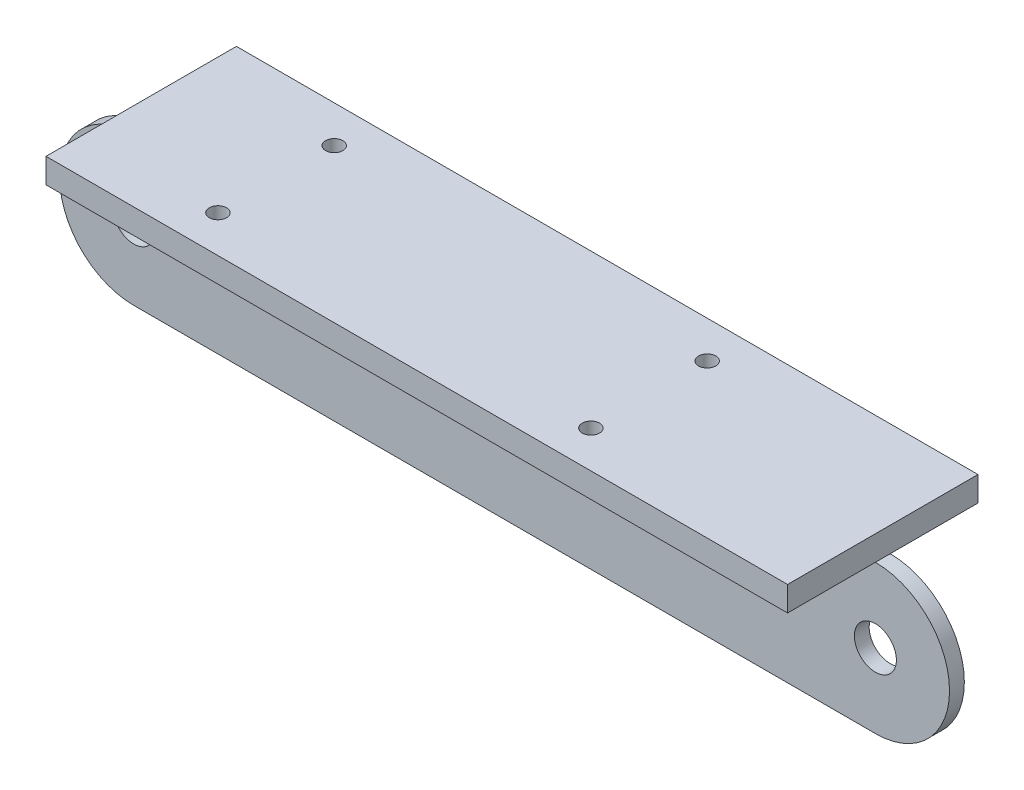
ISO-10303-21;
HEADER;
FILE_DESCRIPTION(('STEP AP214'),'2;1');
FILE_NAME('part.step','',(''),(''),'','','');
FILE_SCHEMA(('AUTOMOTIVE_DESIGN { 1 0 10303 214 1 1 1 1 }'));
ENDSEC;
DATA;
#1=APPLICATION_CONTEXT('core data for automotive mechanical design processes');
#2=APPLICATION_PROTOCOL_DEFINITION('international standard','automotive_design',2000,#1);
#3=PRODUCT_CONTEXT('',#1,'mechanical');
#4=PRODUCT('Part','Part','',(#3));
#5=PRODUCT_RELATED_PRODUCT_CATEGORY('part','',(#4));
#6=PRODUCT_DEFINITION_FORMATION('','',#4);
#7=PRODUCT_DEFINITION_CONTEXT('part definition',#1,'design');
#8=PRODUCT_DEFINITION('design','',#6,#7);
#9=PRODUCT_DEFINITION_SHAPE('','',#8);
#10=(LENGTH_UNIT() NAMED_UNIT(*) SI_UNIT(.MILLI.,.METRE.));
#11=(NAMED_UNIT(*) PLANE_ANGLE_UNIT() SI_UNIT($,.RADIAN.));
#12=(NAMED_UNIT(*) SI_UNIT($,.STERADIAN.) SOLID_ANGLE_UNIT());
#13=UNCERTAINTY_MEASURE_WITH_UNIT(LENGTH_MEASURE(1.E-05),#10,'distance_accuracy_value','');
#14=(GEOMETRIC_REPRESENTATION_CONTEXT(3) GLOBAL_UNCERTAINTY_ASSIGNED_CONTEXT((#13)) GLOBAL_UNIT_ASSIGNED_CONTEXT((#10,
#11,#12)) REPRESENTATION_CONTEXT('',''));
#15=CARTESIAN_POINT('',(0.,0.,0.));
#16=DIRECTION('',(0.,0.,1.));
#17=DIRECTION('',(1.,0.,0.));
#18=AXIS2_PLACEMENT_3D('',#15,#16,#17);
#19=CARTESIAN_POINT('',(-85.207100591716,11.1834319526627,3.));
#20=DIRECTION('',(0.,0.,-1.));
#21=DIRECTION('',(-1.,0.,0.));
#22=AXIS2_PLACEMENT_3D('',#19,#20,#21);
#23=PLANE('',#22);
#24=DIRECTION('',(-1.,0.,0.));
#25=VECTOR('',#24,1.);
#26=CARTESIAN_POINT('',(-85.207100591716,26.1834319526627,3.));
#27=LINE('',#26,#25);
#28=CARTESIAN_POINT('',(64.792899408284,26.1834319526627,3.));
#29=VERTEX_POINT('',#28);
#30=CARTESIAN_POINT('',(39.792899408284,26.1834319526627,3.));
#31=VERTEX_POINT('',#30);
#32=EDGE_CURVE('E279',#29,#31,#27,.T.);
#33=ORIENTED_EDGE('',*,*,#32,.T.);
#34=DIRECTION('',(0.,-1.,0.));
#35=VECTOR('',#34,1.);
#36=CARTESIAN_POINT('',(39.792899408284,26.1834319526627,3.));
#37=LINE('',#36,#35);
#38=CARTESIAN_POINT('',(39.792899408284,19.6834319526627,3.));
#39=VERTEX_POINT('',#38);
#40=EDGE_CURVE('E181',#31,#39,#37,.T.);
#41=ORIENTED_EDGE('',*,*,#40,.T.);
#42=DIRECTION('',(-1.,0.,0.));
#43=VECTOR('',#42,1.);
#44=CARTESIAN_POINT('',(39.792899408284,19.6834319526627,3.));
#45=LINE('',#44,#43);
#46=CARTESIAN_POINT('',(-60.207100591716,19.6834319526627,3.));
#47=VERTEX_POINT('',#46);
#48=EDGE_CURVE('E191',#39,#47,#45,.T.);
#49=ORIENTED_EDGE('',*,*,#48,.T.);
#50=DIRECTION('',(0.,-1.,0.));
#51=VECTOR('',#50,1.);
#52=CARTESIAN_POINT('',(-60.207100591716,26.1834319526627,3.));
#53=LINE('',#52,#51);
#54=CARTESIAN_POINT('',(-60.207100591716,26.1834319526627,3.));
#55=VERTEX_POINT('',#54);
#56=EDGE_CURVE('E166',#55,#47,#53,.T.);
#57=ORIENTED_EDGE('',*,*,#56,.F.);
#58=CARTESIAN_POINT('',(-85.207100591716,26.1834319526627,3.));
#59=VERTEX_POINT('',#58);
#60=EDGE_CURVE('E278',#55,#59,#27,.T.);
#61=ORIENTED_EDGE('',*,*,#60,.T.);
#62=CARTESIAN_POINT('',(-85.207100591716,11.1834319526627,3.));
#63=DIRECTION('',(0.,0.,1.));
#64=DIRECTION('',(-1.,0.,0.));
#65=AXIS2_PLACEMENT_3D('',#62,#63,#64);
#66=CIRCLE('',#65,15.);
#67=CARTESIAN_POINT('',(-85.207100591716,-3.81656804733729,3.));
#68=VERTEX_POINT('',#67);
#69=EDGE_CURVE('E267',#59,#68,#66,.T.);
#70=ORIENTED_EDGE('',*,*,#69,.T.);
#71=DIRECTION('',(1.,0.,0.));
#72=VECTOR('',#71,1.);
#73=CARTESIAN_POINT('',(-85.207100591716,-3.81656804733729,3.));
#74=LINE('',#73,#72);
#75=CARTESIAN_POINT('',(64.792899408284,-3.81656804733729,3.));
#76=VERTEX_POINT('',#75);
#77=EDGE_CURVE('E271',#68,#76,#74,.T.);
#78=ORIENTED_EDGE('',*,*,#77,.T.);
#79=CARTESIAN_POINT('',(64.792899408284,11.1834319526627,3.));
#80=DIRECTION('',(0.,0.,1.));
#81=DIRECTION('',(-1.,0.,0.));
#82=AXIS2_PLACEMENT_3D('',#79,#80,#81);
#83=CIRCLE('',#82,15.);
#84=EDGE_CURVE('E275',#76,#29,#83,.T.);
#85=ORIENTED_EDGE('',*,*,#84,.T.);
#86=EDGE_LOOP('',(#33,#41,#49,#57,#61,#70,#78,#85));
#87=FACE_BOUND('',#86,.T.);
#88=CARTESIAN_POINT('',(-85.207100591716,11.1834319526627,3.));
#89=DIRECTION('',(0.,0.,1.));
#90=DIRECTION('',(1.,0.,0.));
#91=AXIS2_PLACEMENT_3D('',#88,#89,#90);
#92=CIRCLE('',#91,4.25000000000001);
#93=CARTESIAN_POINT('',(-80.957100591716,11.1834319526627,3.));
#94=VERTEX_POINT('',#93);
#95=EDGE_CURVE('E259',#94,#94,#92,.T.);
#96=ORIENTED_EDGE('',*,*,#95,.F.);
#97=EDGE_LOOP('',(#96));
#98=FACE_BOUND('',#97,.T.);
#99=CARTESIAN_POINT('',(64.792899408284,11.1834319526627,3.));
#100=DIRECTION('',(0.,0.,1.));
#101=DIRECTION('',(1.,0.,0.));
#102=AXIS2_PLACEMENT_3D('',#99,#100,#101);
#103=CIRCLE('',#102,4.25000000000001);
#104=CARTESIAN_POINT('',(69.042899408284,11.1834319526627,3.));
#105=VERTEX_POINT('',#104);
#106=EDGE_CURVE('E251',#105,#105,#103,.T.);
#107=ORIENTED_EDGE('',*,*,#106,.F.);
#108=EDGE_LOOP('',(#107));
#109=FACE_BOUND('',#108,.T.);
#110=ADVANCED_FACE('F43',(#87,#98,#109),#23,.F.);
#111=CARTESIAN_POINT('',(-85.207100591716,11.1834319526627,0.));
#112=DIRECTION('',(0.,0.,-1.));
#113=DIRECTION('',(-1.,0.,0.));
#114=AXIS2_PLACEMENT_3D('',#111,#112,#113);
#115=PLANE('',#114);
#116=DIRECTION('',(0.,1.,0.));
#117=VECTOR('',#116,1.);
#118=CARTESIAN_POINT('',(39.792899408284,26.1834319526627,0.));
#119=LINE('',#118,#117);
#120=CARTESIAN_POINT('',(39.792899408284,19.6834319526627,0.));
#121=VERTEX_POINT('',#120);
#122=CARTESIAN_POINT('',(39.792899408284,26.1834319526627,0.));
#123=VERTEX_POINT('',#122);
#124=EDGE_CURVE('E156',#121,#123,#119,.T.);
#125=ORIENTED_EDGE('',*,*,#124,.T.);
#126=DIRECTION('',(-1.,0.,0.));
#127=VECTOR('',#126,1.);
#128=CARTESIAN_POINT('',(-85.207100591716,26.1834319526627,0.));
#129=LINE('',#128,#127);
#130=CARTESIAN_POINT('',(64.792899408284,26.1834319526627,0.));
#131=VERTEX_POINT('',#130);
#132=EDGE_CURVE('E272',#131,#123,#129,.T.);
#133=ORIENTED_EDGE('',*,*,#132,.F.);
#134=CARTESIAN_POINT('',(64.792899408284,11.1834319526627,0.));
#135=DIRECTION('',(0.,0.,1.));
#136=DIRECTION('',(-1.,0.,0.));
#137=AXIS2_PLACEMENT_3D('',#134,#135,#136);
#138=CIRCLE('',#137,15.);
#139=CARTESIAN_POINT('',(64.792899408284,-3.81656804733729,0.));
#140=VERTEX_POINT('',#139);
#141=EDGE_CURVE('E290',#140,#131,#138,.T.);
#142=ORIENTED_EDGE('',*,*,#141,.F.);
#143=DIRECTION('',(1.,0.,0.));
#144=VECTOR('',#143,1.);
#145=CARTESIAN_POINT('',(-85.207100591716,-3.81656804733729,0.));
#146=LINE('',#145,#144);
#147=CARTESIAN_POINT('',(-85.207100591716,-3.81656804733729,0.));
#148=VERTEX_POINT('',#147);
#149=EDGE_CURVE('E287',#148,#140,#146,.T.);
#150=ORIENTED_EDGE('',*,*,#149,.F.);
#151=CARTESIAN_POINT('',(-85.207100591716,11.1834319526627,0.));
#152=DIRECTION('',(0.,0.,1.));
#153=DIRECTION('',(-1.,0.,0.));
#154=AXIS2_PLACEMENT_3D('',#151,#152,#153);
#155=CIRCLE('',#154,15.);
#156=CARTESIAN_POINT('',(-85.207100591716,26.1834319526627,0.));
#157=VERTEX_POINT('',#156);
#158=EDGE_CURVE('E263',#157,#148,#155,.T.);
#159=ORIENTED_EDGE('',*,*,#158,.F.);
#160=CARTESIAN_POINT('',(-60.207100591716,26.1834319526627,0.));
#161=VERTEX_POINT('',#160);
#162=EDGE_CURVE('E294',#161,#157,#129,.T.);
#163=ORIENTED_EDGE('',*,*,#162,.F.);
#164=DIRECTION('',(0.,1.,0.));
#165=VECTOR('',#164,1.);
#166=CARTESIAN_POINT('',(-60.207100591716,26.1834319526627,0.));
#167=LINE('',#166,#165);
#168=CARTESIAN_POINT('',(-60.207100591716,19.6834319526627,0.));
#169=VERTEX_POINT('',#168);
#170=EDGE_CURVE('E66',#169,#161,#167,.T.);
#171=ORIENTED_EDGE('',*,*,#170,.F.);
#172=DIRECTION('',(-1.,0.,0.));
#173=VECTOR('',#172,1.);
#174=CARTESIAN_POINT('',(39.792899408284,19.6834319526627,0.));
#175=LINE('',#174,#173);
#176=EDGE_CURVE('E61',#121,#169,#175,.T.);
#177=ORIENTED_EDGE('',*,*,#176,.F.);
#178=EDGE_LOOP('',(#125,#133,#142,#150,#159,#163,#171,#177));
#179=FACE_BOUND('',#178,.T.);
#180=CARTESIAN_POINT('',(-85.207100591716,11.1834319526627,0.));
#181=DIRECTION('',(0.,0.,1.));
#182=DIRECTION('',(1.,0.,0.));
#183=AXIS2_PLACEMENT_3D('',#180,#181,#182);
#184=CIRCLE('',#183,4.25000000000001);
#185=CARTESIAN_POINT('',(-80.957100591716,11.1834319526627,0.));
#186=VERTEX_POINT('',#185);
#187=EDGE_CURVE('E255',#186,#186,#184,.T.);
#188=ORIENTED_EDGE('',*,*,#187,.T.);
#189=EDGE_LOOP('',(#188));
#190=FACE_BOUND('',#189,.T.);
#191=CARTESIAN_POINT('',(64.792899408284,11.1834319526627,0.));
#192=DIRECTION('',(0.,0.,1.));
#193=DIRECTION('',(1.,0.,0.));
#194=AXIS2_PLACEMENT_3D('',#191,#192,#193);
#195=CIRCLE('',#194,4.25000000000001);
#196=CARTESIAN_POINT('',(69.042899408284,11.1834319526627,0.));
#197=VERTEX_POINT('',#196);
#198=EDGE_CURVE('E250',#197,#197,#195,.T.);
#199=ORIENTED_EDGE('',*,*,#198,.T.);
#200=EDGE_LOOP('',(#199));
#201=FACE_BOUND('',#200,.T.);
#202=ADVANCED_FACE('F357',(#179,#190,#201),#115,.T.);
#203=CARTESIAN_POINT('',(-85.207100591716,11.1834319526627,3.));
#204=DIRECTION('',(0.,0.,-1.));
#205=DIRECTION('',(-1.,0.,0.));
#206=AXIS2_PLACEMENT_3D('',#203,#204,#205);
#207=CYLINDRICAL_SURFACE('',#206,15.);
#208=ORIENTED_EDGE('',*,*,#158,.T.);
#209=DIRECTION('',(0.,0.,-1.));
#210=VECTOR('',#209,1.);
#211=CARTESIAN_POINT('',(-85.207100591716,-3.81656804733729,3.));
#212=LINE('',#211,#210);
#213=EDGE_CURVE('E11',#68,#148,#212,.T.);
#214=ORIENTED_EDGE('',*,*,#213,.F.);
#215=ORIENTED_EDGE('',*,*,#69,.F.);
#216=DIRECTION('',(0.,0.,-1.));
#217=VECTOR('',#216,1.);
#218=CARTESIAN_POINT('',(-85.207100591716,26.1834319526627,3.));
#219=LINE('',#218,#217);
#220=EDGE_CURVE('E283',#59,#157,#219,.T.);
#221=ORIENTED_EDGE('',*,*,#220,.T.);
#222=EDGE_LOOP('',(#208,#214,#215,#221));
#223=FACE_BOUND('',#222,.T.);
#224=ADVANCED_FACE('F45',(#223),#207,.T.);
#225=CARTESIAN_POINT('',(-85.207100591716,-3.81656804733729,3.));
#226=DIRECTION('',(0.,1.,0.));
#227=DIRECTION('',(0.,0.,1.));
#228=AXIS2_PLACEMENT_3D('',#225,#226,#227);
#229=PLANE('',#228);
#230=ORIENTED_EDGE('',*,*,#149,.T.);
#231=DIRECTION('',(0.,0.,-1.));
#232=VECTOR('',#231,1.);
#233=CARTESIAN_POINT('',(64.792899408284,-3.81656804733729,3.));
#234=LINE('',#233,#232);
#235=EDGE_CURVE('E53',#76,#140,#234,.T.);
#236=ORIENTED_EDGE('',*,*,#235,.F.);
#237=ORIENTED_EDGE('',*,*,#77,.F.);
#238=ORIENTED_EDGE('',*,*,#213,.T.);
#239=EDGE_LOOP('',(#230,#236,#237,#238));
#240=FACE_BOUND('',#239,.T.);
#241=ADVANCED_FACE('F371',(#240),#229,.F.);
#242=CARTESIAN_POINT('',(64.792899408284,11.1834319526627,3.));
#243=DIRECTION('',(0.,0.,-1.));
#244=DIRECTION('',(-1.,0.,0.));
#245=AXIS2_PLACEMENT_3D('',#242,#243,#244);
#246=CYLINDRICAL_SURFACE('',#245,15.);
#247=ORIENTED_EDGE('',*,*,#141,.T.);
#248=DIRECTION('',(0.,0.,-1.));
#249=VECTOR('',#248,1.);
#250=CARTESIAN_POINT('',(64.792899408284,26.1834319526627,3.));
#251=LINE('',#250,#249);
#252=EDGE_CURVE('E300',#29,#131,#251,.T.);
#253=ORIENTED_EDGE('',*,*,#252,.F.);
#254=ORIENTED_EDGE('',*,*,#84,.F.);
#255=ORIENTED_EDGE('',*,*,#235,.T.);
#256=EDGE_LOOP('',(#247,#253,#254,#255));
#257=FACE_BOUND('',#256,.T.);
#258=ADVANCED_FACE('F369',(#257),#246,.T.);
#259=CARTESIAN_POINT('',(-85.207100591716,11.1834319526627,3.));
#260=DIRECTION('',(0.,0.,-1.));
#261=DIRECTION('',(-1.,0.,0.));
#262=AXIS2_PLACEMENT_3D('',#259,#260,#261);
#263=CYLINDRICAL_SURFACE('',#262,4.25000000000001);
#264=ORIENTED_EDGE('',*,*,#95,.T.);
#265=EDGE_LOOP('',(#264));
#266=FACE_BOUND('',#265,.T.);
#267=ORIENTED_EDGE('',*,*,#187,.F.);
#268=EDGE_LOOP('',(#267));
#269=FACE_BOUND('',#268,.T.);
#270=ADVANCED_FACE('F366',(#266,#269),#263,.F.);
#271=CARTESIAN_POINT('',(64.792899408284,11.1834319526627,3.));
#272=DIRECTION('',(0.,0.,-1.));
#273=DIRECTION('',(-1.,0.,0.));
#274=AXIS2_PLACEMENT_3D('',#271,#272,#273);
#275=CYLINDRICAL_SURFACE('',#274,4.25000000000001);
#276=ORIENTED_EDGE('',*,*,#106,.T.);
#277=EDGE_LOOP('',(#276));
#278=FACE_BOUND('',#277,.T.);
#279=ORIENTED_EDGE('',*,*,#198,.F.);
#280=EDGE_LOOP('',(#279));
#281=FACE_BOUND('',#280,.T.);
#282=ADVANCED_FACE('F435',(#278,#281),#275,.F.);
#283=CARTESIAN_POINT('',(0.,26.1834319526627,0.));
#284=DIRECTION('',(0.,1.,0.));
#285=DIRECTION('',(0.,0.,1.));
#286=AXIS2_PLACEMENT_3D('',#283,#284,#285);
#287=PLANE('',#286);
#288=CARTESIAN_POINT('',(-57.927100591716,26.1834319526627,13.26));
#289=DIRECTION('',(0.,1.,0.));
#290=DIRECTION('',(0.,0.,1.));
#291=AXIS2_PLACEMENT_3D('',#288,#289,#290);
#292=CIRCLE('',#291,1.75);
#293=CARTESIAN_POINT('',(-57.927100591716,26.1834319526627,15.01));
#294=VERTEX_POINT('',#293);
#295=EDGE_CURVE('E332',#294,#294,#292,.T.);
#296=ORIENTED_EDGE('',*,*,#295,.T.);
#297=EDGE_LOOP('',(#296));
#298=FACE_BOUND('',#297,.T.);
#299=CARTESIAN_POINT('',(17.512899408284,26.1834319526627,13.26));
#300=DIRECTION('',(0.,1.,0.));
#301=DIRECTION('',(0.,0.,1.));
#302=AXIS2_PLACEMENT_3D('',#299,#300,#301);
#303=CIRCLE('',#302,1.75);
#304=CARTESIAN_POINT('',(17.512899408284,26.1834319526627,15.01));
#305=VERTEX_POINT('',#304);
#306=EDGE_CURVE('E315',#305,#305,#303,.T.);
#307=ORIENTED_EDGE('',*,*,#306,.T.);
#308=EDGE_LOOP('',(#307));
#309=FACE_BOUND('',#308,.T.);
#310=DIRECTION('',(-1.,0.,0.));
#311=VECTOR('',#310,1.);
#312=CARTESIAN_POINT('',(39.792899408284,26.1834319526627,9.5));
#313=LINE('',#312,#311);
#314=CARTESIAN_POINT('',(39.792899408284,26.1834319526627,9.5));
#315=VERTEX_POINT('',#314);
#316=CARTESIAN_POINT('',(-60.207100591716,26.1834319526627,9.5));
#317=VERTEX_POINT('',#316);
#318=EDGE_CURVE('E199',#315,#317,#313,.T.);
#319=ORIENTED_EDGE('',*,*,#318,.F.);
#320=DIRECTION('',(0.,0.,-1.));
#321=VECTOR('',#320,1.);
#322=CARTESIAN_POINT('',(39.792899408284,26.1834319526627,9.5));
#323=LINE('',#322,#321);
#324=EDGE_CURVE('E189',#315,#31,#323,.T.);
#325=ORIENTED_EDGE('',*,*,#324,.T.);
#326=ORIENTED_EDGE('',*,*,#32,.F.);
#327=DIRECTION('',(0.,0.,-1.));
#328=VECTOR('',#327,1.);
#329=CARTESIAN_POINT('',(64.792899408284,26.1834319526627,-17.76));
#330=LINE('',#329,#328);
#331=CARTESIAN_POINT('',(64.792899408284,26.1834319526627,20.76));
#332=VERTEX_POINT('',#331);
#333=EDGE_CURVE('E229',#332,#29,#330,.T.);
#334=ORIENTED_EDGE('',*,*,#333,.F.);
#335=DIRECTION('',(1.,0.,0.));
#336=VECTOR('',#335,1.);
#337=CARTESIAN_POINT('',(-85.207100591716,26.1834319526627,20.76));
#338=LINE('',#337,#336);
#339=CARTESIAN_POINT('',(-85.207100591716,26.1834319526627,20.76));
#340=VERTEX_POINT('',#339);
#341=EDGE_CURVE('E225',#340,#332,#338,.T.);
#342=ORIENTED_EDGE('',*,*,#341,.F.);
#343=DIRECTION('',(0.,0.,1.));
#344=VECTOR('',#343,1.);
#345=CARTESIAN_POINT('',(-85.207100591716,26.1834319526627,-17.76));
#346=LINE('',#345,#344);
#347=EDGE_CURVE('E203',#59,#340,#346,.T.);
#348=ORIENTED_EDGE('',*,*,#347,.F.);
#349=ORIENTED_EDGE('',*,*,#60,.F.);
#350=DIRECTION('',(0.,0.,-1.));
#351=VECTOR('',#350,1.);
#352=CARTESIAN_POINT('',(-60.207100591716,26.1834319526627,9.5));
#353=LINE('',#352,#351);
#354=EDGE_CURVE('E185',#317,#55,#353,.T.);
#355=ORIENTED_EDGE('',*,*,#354,.F.);
#356=EDGE_LOOP('',(#319,#325,#326,#334,#342,#348,#349,#355));
#357=FACE_BOUND('',#356,.T.);
#358=ADVANCED_FACE('F340',(#298,#309,#357),#287,.F.);
#359=CARTESIAN_POINT('',(-85.207100591716,31.1834319526627,-17.76));
#360=DIRECTION('',(1.,0.,0.));
#361=DIRECTION('',(0.,0.,-1.));
#362=AXIS2_PLACEMENT_3D('',#359,#360,#361);
#363=PLANE('',#362);
#364=CARTESIAN_POINT('',(-85.207100591716,26.1834319526627,-17.76));
#365=VERTEX_POINT('',#364);
#366=EDGE_CURVE('E221',#365,#157,#346,.T.);
#367=ORIENTED_EDGE('',*,*,#366,.T.);
#368=ORIENTED_EDGE('',*,*,#220,.F.);
#369=ORIENTED_EDGE('',*,*,#347,.T.);
#370=DIRECTION('',(0.,-1.,0.));
#371=VECTOR('',#370,1.);
#372=CARTESIAN_POINT('',(-85.207100591716,31.1834319526627,20.76));
#373=LINE('',#372,#371);
#374=CARTESIAN_POINT('',(-85.207100591716,31.1834319526627,20.76));
#375=VERTEX_POINT('',#374);
#376=EDGE_CURVE('E246',#375,#340,#373,.T.);
#377=ORIENTED_EDGE('',*,*,#376,.F.);
#378=DIRECTION('',(0.,0.,1.));
#379=VECTOR('',#378,1.);
#380=CARTESIAN_POINT('',(-85.207100591716,31.1834319526627,-17.76));
#381=LINE('',#380,#379);
#382=CARTESIAN_POINT('',(-85.207100591716,31.1834319526627,-17.76));
#383=VERTEX_POINT('',#382);
#384=EDGE_CURVE('E206',#383,#375,#381,.T.);
#385=ORIENTED_EDGE('',*,*,#384,.F.);
#386=DIRECTION('',(0.,-1.,0.));
#387=VECTOR('',#386,1.);
#388=CARTESIAN_POINT('',(-85.207100591716,31.1834319526627,-17.76));
#389=LINE('',#388,#387);
#390=EDGE_CURVE('E220',#383,#365,#389,.T.);
#391=ORIENTED_EDGE('',*,*,#390,.T.);
#392=EDGE_LOOP('',(#367,#368,#369,#377,#385,#391));
#393=FACE_BOUND('',#392,.T.);
#394=ADVANCED_FACE('F431',(#393),#363,.F.);
#395=CARTESIAN_POINT('',(-85.207100591716,31.1834319526627,20.76));
#396=DIRECTION('',(0.,0.,-1.));
#397=DIRECTION('',(-1.,0.,0.));
#398=AXIS2_PLACEMENT_3D('',#395,#396,#397);
#399=PLANE('',#398);
#400=ORIENTED_EDGE('',*,*,#341,.T.);
#401=DIRECTION('',(0.,-1.,0.));
#402=VECTOR('',#401,1.);
#403=CARTESIAN_POINT('',(64.792899408284,31.1834319526627,20.76));
#404=LINE('',#403,#402);
#405=CARTESIAN_POINT('',(64.792899408284,31.1834319526627,20.76));
#406=VERTEX_POINT('',#405);
#407=EDGE_CURVE('E242',#406,#332,#404,.T.);
#408=ORIENTED_EDGE('',*,*,#407,.F.);
#409=DIRECTION('',(1.,0.,0.));
#410=VECTOR('',#409,1.);
#411=CARTESIAN_POINT('',(-85.207100591716,31.1834319526627,20.76));
#412=LINE('',#411,#410);
#413=EDGE_CURVE('E210',#375,#406,#412,.T.);
#414=ORIENTED_EDGE('',*,*,#413,.F.);
#415=ORIENTED_EDGE('',*,*,#376,.T.);
#416=EDGE_LOOP('',(#400,#408,#414,#415));
#417=FACE_BOUND('',#416,.T.);
#418=ADVANCED_FACE('F427',(#417),#399,.F.);
#419=CARTESIAN_POINT('',(64.792899408284,31.1834319526627,-17.76));
#420=DIRECTION('',(-1.,0.,0.));
#421=DIRECTION('',(0.,0.,1.));
#422=AXIS2_PLACEMENT_3D('',#419,#420,#421);
#423=PLANE('',#422);
#424=ORIENTED_EDGE('',*,*,#333,.T.);
#425=ORIENTED_EDGE('',*,*,#252,.T.);
#426=CARTESIAN_POINT('',(64.792899408284,26.1834319526627,-17.76));
#427=VERTEX_POINT('',#426);
#428=EDGE_CURVE('E228',#131,#427,#330,.T.);
#429=ORIENTED_EDGE('',*,*,#428,.T.);
#430=DIRECTION('',(0.,-1.,0.));
#431=VECTOR('',#430,1.);
#432=CARTESIAN_POINT('',(64.792899408284,31.1834319526627,-17.76));
#433=LINE('',#432,#431);
#434=CARTESIAN_POINT('',(64.792899408284,31.1834319526627,-17.76));
#435=VERTEX_POINT('',#434);
#436=EDGE_CURVE('E238',#435,#427,#433,.T.);
#437=ORIENTED_EDGE('',*,*,#436,.F.);
#438=DIRECTION('',(0.,0.,-1.));
#439=VECTOR('',#438,1.);
#440=CARTESIAN_POINT('',(64.792899408284,31.1834319526627,-17.76));
#441=LINE('',#440,#439);
#442=EDGE_CURVE('E214',#406,#435,#441,.T.);
#443=ORIENTED_EDGE('',*,*,#442,.F.);
#444=ORIENTED_EDGE('',*,*,#407,.T.);
#445=EDGE_LOOP('',(#424,#425,#429,#437,#443,#444));
#446=FACE_BOUND('',#445,.T.);
#447=ADVANCED_FACE('F423',(#446),#423,.F.);
#448=CARTESIAN_POINT('',(-85.207100591716,31.1834319526627,-17.76));
#449=DIRECTION('',(0.,0.,1.));
#450=DIRECTION('',(1.,0.,0.));
#451=AXIS2_PLACEMENT_3D('',#448,#449,#450);
#452=PLANE('',#451);
#453=DIRECTION('',(-1.,0.,0.));
#454=VECTOR('',#453,1.);
#455=CARTESIAN_POINT('',(-85.207100591716,26.1834319526627,-17.76));
#456=LINE('',#455,#454);
#457=EDGE_CURVE('E211',#427,#365,#456,.T.);
#458=ORIENTED_EDGE('',*,*,#457,.T.);
#459=ORIENTED_EDGE('',*,*,#390,.F.);
#460=DIRECTION('',(-1.,0.,0.));
#461=VECTOR('',#460,1.);
#462=CARTESIAN_POINT('',(-85.207100591716,31.1834319526627,-17.76));
#463=LINE('',#462,#461);
#464=EDGE_CURVE('E217',#435,#383,#463,.T.);
#465=ORIENTED_EDGE('',*,*,#464,.F.);
#466=ORIENTED_EDGE('',*,*,#436,.T.);
#467=EDGE_LOOP('',(#458,#459,#465,#466));
#468=FACE_BOUND('',#467,.T.);
#469=ADVANCED_FACE('F416',(#468),#452,.F.);
#470=CARTESIAN_POINT('',(0.,31.1834319526627,0.));
#471=DIRECTION('',(0.,1.,0.));
#472=DIRECTION('',(0.,0.,1.));
#473=AXIS2_PLACEMENT_3D('',#470,#471,#472);
#474=PLANE('',#473);
#475=CARTESIAN_POINT('',(-57.927100591716,31.1834319526627,-10.26));
#476=DIRECTION('',(0.,1.,0.));
#477=DIRECTION('',(0.,0.,-1.));
#478=AXIS2_PLACEMENT_3D('',#475,#476,#477);
#479=CIRCLE('',#478,1.75);
#480=CARTESIAN_POINT('',(-57.927100591716,31.1834319526627,-12.01));
#481=VERTEX_POINT('',#480);
#482=EDGE_CURVE('E327',#481,#481,#479,.T.);
#483=ORIENTED_EDGE('',*,*,#482,.F.);
#484=EDGE_LOOP('',(#483));
#485=FACE_BOUND('',#484,.T.);
#486=CARTESIAN_POINT('',(-57.927100591716,31.1834319526627,13.26));
#487=DIRECTION('',(0.,1.,0.));
#488=DIRECTION('',(0.,0.,1.));
#489=AXIS2_PLACEMENT_3D('',#486,#487,#488);
#490=CIRCLE('',#489,1.75);
#491=CARTESIAN_POINT('',(-57.927100591716,31.1834319526627,15.01));
#492=VERTEX_POINT('',#491);
#493=EDGE_CURVE('E323',#492,#492,#490,.T.);
#494=ORIENTED_EDGE('',*,*,#493,.F.);
#495=EDGE_LOOP('',(#494));
#496=FACE_BOUND('',#495,.T.);
#497=CARTESIAN_POINT('',(17.512899408284,31.1834319526627,13.26));
#498=DIRECTION('',(0.,1.,0.));
#499=DIRECTION('',(0.,0.,-1.));
#500=AXIS2_PLACEMENT_3D('',#497,#498,#499);
#501=CIRCLE('',#500,1.75);
#502=CARTESIAN_POINT('',(17.512899408284,31.1834319526627,11.51));
#503=VERTEX_POINT('',#502);
#504=EDGE_CURVE('E317',#503,#503,#501,.T.);
#505=ORIENTED_EDGE('',*,*,#504,.F.);
#506=EDGE_LOOP('',(#505));
#507=FACE_BOUND('',#506,.T.);
#508=CARTESIAN_POINT('',(17.512899408284,31.1834319526627,-10.26));
#509=DIRECTION('',(0.,1.,0.));
#510=DIRECTION('',(0.,0.,1.));
#511=AXIS2_PLACEMENT_3D('',#508,#509,#510);
#512=CIRCLE('',#511,1.75);
#513=CARTESIAN_POINT('',(17.512899408284,31.1834319526627,-8.50999999999999));
#514=VERTEX_POINT('',#513);
#515=EDGE_CURVE('E309',#514,#514,#512,.T.);
#516=ORIENTED_EDGE('',*,*,#515,.F.);
#517=EDGE_LOOP('',(#516));
#518=FACE_BOUND('',#517,.T.);
#519=ORIENTED_EDGE('',*,*,#384,.T.);
#520=ORIENTED_EDGE('',*,*,#413,.T.);
#521=ORIENTED_EDGE('',*,*,#442,.T.);
#522=ORIENTED_EDGE('',*,*,#464,.T.);
#523=EDGE_LOOP('',(#519,#520,#521,#522));
#524=FACE_BOUND('',#523,.T.);
#525=ADVANCED_FACE('F413',(#485,#496,#507,#518,#524),#474,.T.);
#526=CARTESIAN_POINT('',(-57.927100591716,26.1834319526627,-10.26));
#527=DIRECTION('',(0.,1.,0.));
#528=DIRECTION('',(0.,0.,1.));
#529=AXIS2_PLACEMENT_3D('',#526,#527,#528);
#530=CIRCLE('',#529,1.75);
#531=CARTESIAN_POINT('',(-57.927100591716,26.1834319526627,-8.50999999999999));
#532=VERTEX_POINT('',#531);
#533=EDGE_CURVE('E47',#532,#532,#530,.T.);
#534=ORIENTED_EDGE('',*,*,#533,.T.);
#535=EDGE_LOOP('',(#534));
#536=FACE_BOUND('',#535,.T.);
#537=CARTESIAN_POINT('',(17.512899408284,26.1834319526627,-10.26));
#538=DIRECTION('',(0.,1.,0.));
#539=DIRECTION('',(0.,0.,1.));
#540=AXIS2_PLACEMENT_3D('',#537,#538,#539);
#541=CIRCLE('',#540,1.75);
#542=CARTESIAN_POINT('',(17.512899408284,26.1834319526627,-8.50999999999999));
#543=VERTEX_POINT('',#542);
#544=EDGE_CURVE('E306',#543,#543,#541,.T.);
#545=ORIENTED_EDGE('',*,*,#544,.T.);
#546=EDGE_LOOP('',(#545));
#547=FACE_BOUND('',#546,.T.);
#548=ORIENTED_EDGE('',*,*,#132,.T.);
#549=DIRECTION('',(0.,0.,-1.));
#550=VECTOR('',#549,1.);
#551=CARTESIAN_POINT('',(39.792899408284,26.1834319526627,-6.50000000000031));
#552=LINE('',#551,#550);
#553=CARTESIAN_POINT('',(39.792899408284,26.1834319526627,-6.50000000000031));
#554=VERTEX_POINT('',#553);
#555=EDGE_CURVE('E152',#123,#554,#552,.T.);
#556=ORIENTED_EDGE('',*,*,#555,.T.);
#557=DIRECTION('',(-1.,0.,0.));
#558=VECTOR('',#557,1.);
#559=CARTESIAN_POINT('',(39.792899408284,26.1834319526627,-6.50000000000031));
#560=LINE('',#559,#558);
#561=CARTESIAN_POINT('',(-60.207100591716,26.1834319526627,-6.50000000000031));
#562=VERTEX_POINT('',#561);
#563=EDGE_CURVE('E145',#554,#562,#560,.T.);
#564=ORIENTED_EDGE('',*,*,#563,.T.);
#565=DIRECTION('',(0.,0.,-1.));
#566=VECTOR('',#565,1.);
#567=CARTESIAN_POINT('',(-60.207100591716,26.1834319526627,-6.50000000000031));
#568=LINE('',#567,#566);
#569=EDGE_CURVE('E150',#161,#562,#568,.T.);
#570=ORIENTED_EDGE('',*,*,#569,.F.);
#571=ORIENTED_EDGE('',*,*,#162,.T.);
#572=ORIENTED_EDGE('',*,*,#366,.F.);
#573=ORIENTED_EDGE('',*,*,#457,.F.);
#574=ORIENTED_EDGE('',*,*,#428,.F.);
#575=EDGE_LOOP('',(#548,#556,#564,#570,#571,#572,#573,#574));
#576=FACE_BOUND('',#575,.T.);
#577=ADVANCED_FACE('F148',(#536,#547,#576),#287,.F.);
#578=CARTESIAN_POINT('',(39.792899408284,19.6834319526627,3.));
#579=DIRECTION('',(0.,-0.707106781186548,0.707106781186547));
#580=DIRECTION('',(0.,-0.707106781186547,-0.707106781186548));
#581=AXIS2_PLACEMENT_3D('',#578,#579,#580);
#582=PLANE('',#581);
#583=DIRECTION('',(0.,0.707106781186547,0.707106781186548));
#584=VECTOR('',#583,1.);
#585=CARTESIAN_POINT('',(-60.207100591716,19.6834319526627,3.));
#586=LINE('',#585,#584);
#587=EDGE_CURVE('E170',#47,#317,#586,.T.);
#588=ORIENTED_EDGE('',*,*,#587,.F.);
#589=ORIENTED_EDGE('',*,*,#48,.F.);
#590=DIRECTION('',(0.,0.707106781186547,0.707106781186548));
#591=VECTOR('',#590,1.);
#592=CARTESIAN_POINT('',(39.792899408284,19.6834319526627,3.));
#593=LINE('',#592,#591);
#594=EDGE_CURVE('E184',#39,#315,#593,.T.);
#595=ORIENTED_EDGE('',*,*,#594,.T.);
#596=ORIENTED_EDGE('',*,*,#318,.T.);
#597=EDGE_LOOP('',(#588,#589,#595,#596));
#598=FACE_BOUND('',#597,.T.);
#599=ADVANCED_FACE('F405',(#598),#582,.T.);
#600=CARTESIAN_POINT('',(39.792899408284,0.,0.));
#601=DIRECTION('',(1.,0.,0.));
#602=DIRECTION('',(0.,0.,-1.));
#603=AXIS2_PLACEMENT_3D('',#600,#601,#602);
#604=PLANE('',#603);
#605=ORIENTED_EDGE('',*,*,#40,.F.);
#606=ORIENTED_EDGE('',*,*,#324,.F.);
#607=ORIENTED_EDGE('',*,*,#594,.F.);
#608=EDGE_LOOP('',(#605,#606,#607));
#609=FACE_BOUND('',#608,.T.);
#610=ADVANCED_FACE('F402',(#609),#604,.T.);
#611=CARTESIAN_POINT('',(-60.207100591716,0.,0.));
#612=DIRECTION('',(1.,0.,0.));
#613=DIRECTION('',(0.,0.,-1.));
#614=AXIS2_PLACEMENT_3D('',#611,#612,#613);
#615=PLANE('',#614);
#616=ORIENTED_EDGE('',*,*,#56,.T.);
#617=ORIENTED_EDGE('',*,*,#587,.T.);
#618=ORIENTED_EDGE('',*,*,#354,.T.);
#619=EDGE_LOOP('',(#616,#617,#618));
#620=FACE_BOUND('',#619,.T.);
#621=ADVANCED_FACE('F399',(#620),#615,.F.);
#622=CARTESIAN_POINT('',(39.792899408284,19.6834319526627,0.));
#623=DIRECTION('',(0.,-0.707106781186564,-0.707106781186531));
#624=DIRECTION('',(0.,0.707106781186531,-0.707106781186564));
#625=AXIS2_PLACEMENT_3D('',#622,#623,#624);
#626=PLANE('',#625);
#627=DIRECTION('',(0.,-0.707106781186531,0.707106781186564));
#628=VECTOR('',#627,1.);
#629=CARTESIAN_POINT('',(-60.207100591716,19.6834319526627,0.));
#630=LINE('',#629,#628);
#631=EDGE_CURVE('E159',#562,#169,#630,.T.);
#632=ORIENTED_EDGE('',*,*,#631,.F.);
#633=ORIENTED_EDGE('',*,*,#563,.F.);
#634=DIRECTION('',(0.,-0.707106781186531,0.707106781186564));
#635=VECTOR('',#634,1.);
#636=CARTESIAN_POINT('',(39.792899408284,19.6834319526627,0.));
#637=LINE('',#636,#635);
#638=EDGE_CURVE('E176',#554,#121,#637,.T.);
#639=ORIENTED_EDGE('',*,*,#638,.T.);
#640=ORIENTED_EDGE('',*,*,#176,.T.);
#641=EDGE_LOOP('',(#632,#633,#639,#640));
#642=FACE_BOUND('',#641,.T.);
#643=ADVANCED_FACE('F160',(#642),#626,.T.);
#644=CARTESIAN_POINT('',(39.792899408284,0.,0.));
#645=DIRECTION('',(1.,0.,0.));
#646=DIRECTION('',(0.,0.,-1.));
#647=AXIS2_PLACEMENT_3D('',#644,#645,#646);
#648=PLANE('',#647);
#649=ORIENTED_EDGE('',*,*,#555,.F.);
#650=ORIENTED_EDGE('',*,*,#124,.F.);
#651=ORIENTED_EDGE('',*,*,#638,.F.);
#652=EDGE_LOOP('',(#649,#650,#651));
#653=FACE_BOUND('',#652,.T.);
#654=ADVANCED_FACE('F390',(#653),#648,.T.);
#655=CARTESIAN_POINT('',(-60.207100591716,0.,0.));
#656=DIRECTION('',(1.,0.,0.));
#657=DIRECTION('',(0.,0.,-1.));
#658=AXIS2_PLACEMENT_3D('',#655,#656,#657);
#659=PLANE('',#658);
#660=ORIENTED_EDGE('',*,*,#569,.T.);
#661=ORIENTED_EDGE('',*,*,#631,.T.);
#662=ORIENTED_EDGE('',*,*,#170,.T.);
#663=EDGE_LOOP('',(#660,#661,#662));
#664=FACE_BOUND('',#663,.T.);
#665=ADVANCED_FACE('F164',(#664),#659,.F.);
#666=CARTESIAN_POINT('',(17.512899408284,21.1834319526627,-10.26));
#667=DIRECTION('',(0.,1.,0.));
#668=DIRECTION('',(0.,0.,1.));
#669=AXIS2_PLACEMENT_3D('',#666,#667,#668);
#670=CYLINDRICAL_SURFACE('',#669,1.75);
#671=ORIENTED_EDGE('',*,*,#515,.T.);
#672=EDGE_LOOP('',(#671));
#673=FACE_BOUND('',#672,.T.);
#674=ORIENTED_EDGE('',*,*,#544,.F.);
#675=EDGE_LOOP('',(#674));
#676=FACE_BOUND('',#675,.T.);
#677=ADVANCED_FACE('F397',(#673,#676),#670,.F.);
#678=CARTESIAN_POINT('',(-57.927100591716,21.1834319526627,-10.26));
#679=DIRECTION('',(0.,1.,0.));
#680=DIRECTION('',(0.,0.,1.));
#681=AXIS2_PLACEMENT_3D('',#678,#679,#680);
#682=CYLINDRICAL_SURFACE('',#681,1.75);
#683=ORIENTED_EDGE('',*,*,#482,.T.);
#684=EDGE_LOOP('',(#683));
#685=FACE_BOUND('',#684,.T.);
#686=ORIENTED_EDGE('',*,*,#533,.F.);
#687=EDGE_LOOP('',(#686));
#688=FACE_BOUND('',#687,.T.);
#689=ADVANCED_FACE('F351',(#685,#688),#682,.F.);
#690=CARTESIAN_POINT('',(17.512899408284,21.1834319526627,13.26));
#691=DIRECTION('',(0.,1.,0.));
#692=DIRECTION('',(0.,0.,1.));
#693=AXIS2_PLACEMENT_3D('',#690,#691,#692);
#694=CYLINDRICAL_SURFACE('',#693,1.75);
#695=ORIENTED_EDGE('',*,*,#504,.T.);
#696=EDGE_LOOP('',(#695));
#697=FACE_BOUND('',#696,.T.);
#698=ORIENTED_EDGE('',*,*,#306,.F.);
#699=EDGE_LOOP('',(#698));
#700=FACE_BOUND('',#699,.T.);
#701=ADVANCED_FACE('F345',(#697,#700),#694,.F.);
#702=CARTESIAN_POINT('',(-57.927100591716,21.1834319526627,13.26));
#703=DIRECTION('',(0.,1.,0.));
#704=DIRECTION('',(0.,0.,1.));
#705=AXIS2_PLACEMENT_3D('',#702,#703,#704);
#706=CYLINDRICAL_SURFACE('',#705,1.75);
#707=ORIENTED_EDGE('',*,*,#493,.T.);
#708=EDGE_LOOP('',(#707));
#709=FACE_BOUND('',#708,.T.);
#710=ORIENTED_EDGE('',*,*,#295,.F.);
#711=EDGE_LOOP('',(#710));
#712=FACE_BOUND('',#711,.T.);
#713=ADVANCED_FACE('F343',(#709,#712),#706,.F.);
#714=CLOSED_SHELL('',(#110,#202,#224,#241,#258,#270,#282,#358,#394,#418,#447,#469,#525,#577,
#599,#610,#621,#643,#654,#665,#677,#689,#701,#713));
#715=MANIFOLD_SOLID_BREP('B2',#714);
#716=ADVANCED_BREP_SHAPE_REPRESENTATION('',(#18,#715),#14);
#717=SHAPE_DEFINITION_REPRESENTATION(#9,#716);
ENDSEC;
END-ISO-10303-21;
